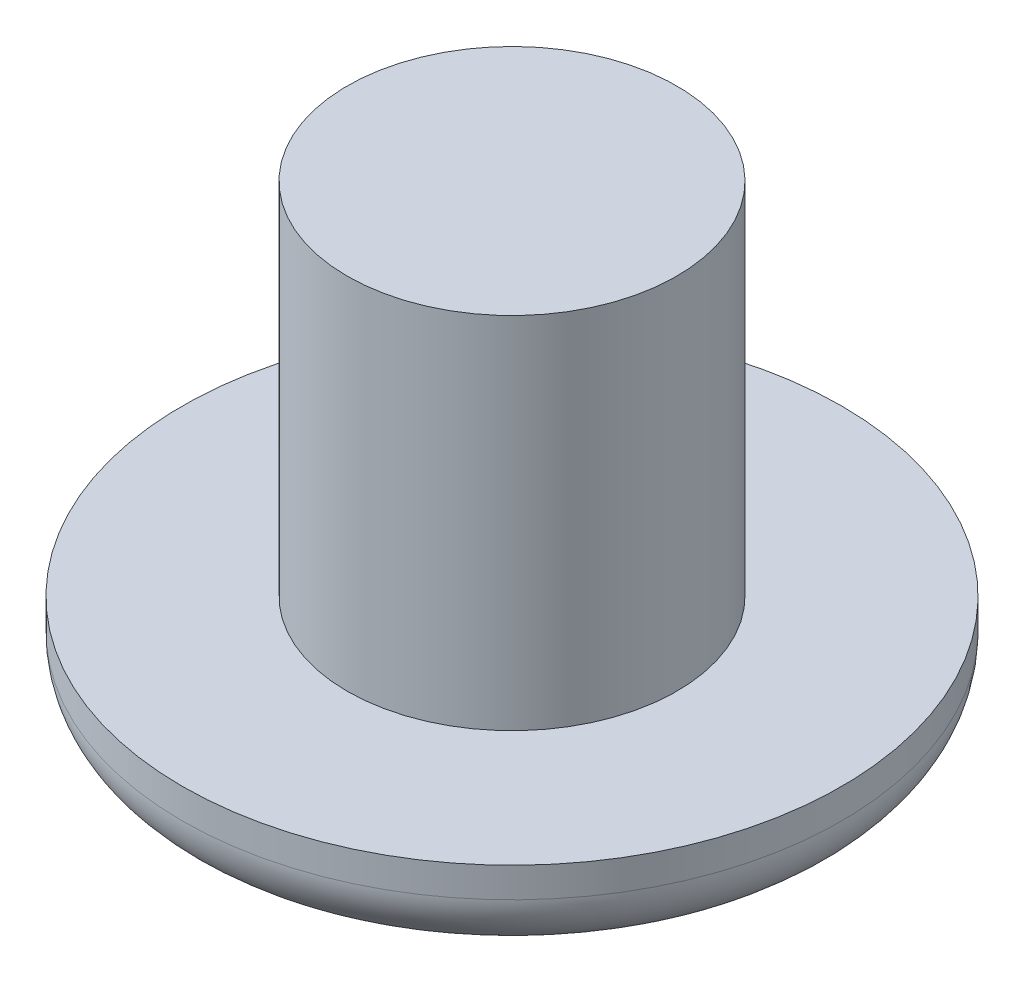
ISO-10303-21;
HEADER;
FILE_DESCRIPTION(('STEP AP214'),'2;1');
FILE_NAME('part.step','',(''),(''),'','','');
FILE_SCHEMA(('AUTOMOTIVE_DESIGN { 1 0 10303 214 1 1 1 1 }'));
ENDSEC;
DATA;
#1=APPLICATION_CONTEXT('core data for automotive mechanical design processes');
#2=APPLICATION_PROTOCOL_DEFINITION('international standard','automotive_design',2000,#1);
#3=PRODUCT_CONTEXT('',#1,'mechanical');
#4=PRODUCT('Part','Part','',(#3));
#5=PRODUCT_RELATED_PRODUCT_CATEGORY('part','',(#4));
#6=PRODUCT_DEFINITION_FORMATION('','',#4);
#7=PRODUCT_DEFINITION_CONTEXT('part definition',#1,'design');
#8=PRODUCT_DEFINITION('design','',#6,#7);
#9=PRODUCT_DEFINITION_SHAPE('','',#8);
#10=(LENGTH_UNIT() NAMED_UNIT(*) SI_UNIT(.MILLI.,.METRE.));
#11=(NAMED_UNIT(*) PLANE_ANGLE_UNIT() SI_UNIT($,.RADIAN.));
#12=(NAMED_UNIT(*) SI_UNIT($,.STERADIAN.) SOLID_ANGLE_UNIT());
#13=UNCERTAINTY_MEASURE_WITH_UNIT(LENGTH_MEASURE(1.E-05),#10,'distance_accuracy_value','');
#14=(GEOMETRIC_REPRESENTATION_CONTEXT(3) GLOBAL_UNCERTAINTY_ASSIGNED_CONTEXT((#13)) GLOBAL_UNIT_ASSIGNED_CONTEXT((#10,
#11,#12)) REPRESENTATION_CONTEXT('',''));
#15=CARTESIAN_POINT('',(0.,0.,0.));
#16=DIRECTION('',(0.,0.,1.));
#17=DIRECTION('',(1.,0.,0.));
#18=AXIS2_PLACEMENT_3D('',#15,#16,#17);
#19=CARTESIAN_POINT('',(0.,3.,0.));
#20=DIRECTION('',(0.,1.,0.));
#21=DIRECTION('',(0.,0.,1.));
#22=AXIS2_PLACEMENT_3D('',#19,#20,#21);
#23=PLANE('',#22);
#24=CARTESIAN_POINT('',(0.,3.,0.));
#25=DIRECTION('',(0.,1.,0.));
#26=DIRECTION('',(0.,0.,1.));
#27=AXIS2_PLACEMENT_3D('',#24,#25,#26);
#28=CIRCLE('',#27,11.);
#29=CARTESIAN_POINT('',(0.,3.,11.));
#30=VERTEX_POINT('',#29);
#31=EDGE_CURVE('E44',#30,#30,#28,.T.);
#32=ORIENTED_EDGE('',*,*,#31,.T.);
#33=EDGE_LOOP('',(#32));
#34=FACE_BOUND('',#33,.T.);
#35=CARTESIAN_POINT('',(0.,3.,0.));
#36=DIRECTION('',(0.,1.,0.));
#37=DIRECTION('',(0.,0.,1.));
#38=AXIS2_PLACEMENT_3D('',#35,#36,#37);
#39=CIRCLE('',#38,5.5);
#40=CARTESIAN_POINT('',(0.,3.,5.5));
#41=VERTEX_POINT('',#40);
#42=EDGE_CURVE('E48',#41,#41,#39,.T.);
#43=ORIENTED_EDGE('',*,*,#42,.F.);
#44=EDGE_LOOP('',(#43));
#45=FACE_BOUND('',#44,.T.);
#46=ADVANCED_FACE('F33',(#34,#45),#23,.T.);
#47=CARTESIAN_POINT('',(0.,0.,0.));
#48=DIRECTION('',(0.,1.,0.));
#49=DIRECTION('',(0.,0.,1.));
#50=AXIS2_PLACEMENT_3D('',#47,#48,#49);
#51=PLANE('',#50);
#52=CARTESIAN_POINT('',(0.,0.,0.));
#53=DIRECTION('',(0.,1.,0.));
#54=DIRECTION('',(0.,0.,1.));
#55=AXIS2_PLACEMENT_3D('',#52,#53,#54);
#56=CIRCLE('',#55,9.);
#57=CARTESIAN_POINT('',(0.,0.,9.));
#58=VERTEX_POINT('',#57);
#59=EDGE_CURVE('E10',#58,#58,#56,.F.);
#60=ORIENTED_EDGE('',*,*,#59,.T.);
#61=EDGE_LOOP('',(#60));
#62=FACE_BOUND('',#61,.T.);
#63=ADVANCED_FACE('F69',(#62),#51,.F.);
#64=CARTESIAN_POINT('',(0.,3.,0.));
#65=DIRECTION('',(0.,-1.,0.));
#66=DIRECTION('',(0.,0.,-1.));
#67=AXIS2_PLACEMENT_3D('',#64,#65,#66);
#68=CYLINDRICAL_SURFACE('',#67,11.);
#69=CARTESIAN_POINT('',(0.,2.,0.));
#70=DIRECTION('',(0.,1.,0.));
#71=DIRECTION('',(0.,0.,1.));
#72=AXIS2_PLACEMENT_3D('',#69,#70,#71);
#73=CIRCLE('',#72,11.);
#74=CARTESIAN_POINT('',(0.,2.,11.));
#75=VERTEX_POINT('',#74);
#76=EDGE_CURVE('E40',#75,#75,#73,.T.);
#77=ORIENTED_EDGE('',*,*,#76,.T.);
#78=EDGE_LOOP('',(#77));
#79=FACE_BOUND('',#78,.T.);
#80=ORIENTED_EDGE('',*,*,#31,.F.);
#81=EDGE_LOOP('',(#80));
#82=FACE_BOUND('',#81,.T.);
#83=ADVANCED_FACE('F61',(#79,#82),#68,.T.);
#84=CARTESIAN_POINT('',(0.,15.,0.));
#85=DIRECTION('',(0.,-1.,0.));
#86=DIRECTION('',(0.,0.,-1.));
#87=AXIS2_PLACEMENT_3D('',#84,#85,#86);
#88=CYLINDRICAL_SURFACE('',#87,5.5);
#89=ORIENTED_EDGE('',*,*,#42,.T.);
#90=EDGE_LOOP('',(#89));
#91=FACE_BOUND('',#90,.T.);
#92=CARTESIAN_POINT('',(0.,15.,0.));
#93=DIRECTION('',(0.,1.,0.));
#94=DIRECTION('',(0.,0.,1.));
#95=AXIS2_PLACEMENT_3D('',#92,#93,#94);
#96=CIRCLE('',#95,5.5);
#97=CARTESIAN_POINT('',(0.,15.,5.5));
#98=VERTEX_POINT('',#97);
#99=EDGE_CURVE('E53',#98,#98,#96,.T.);
#100=ORIENTED_EDGE('',*,*,#99,.F.);
#101=EDGE_LOOP('',(#100));
#102=FACE_BOUND('',#101,.T.);
#103=ADVANCED_FACE('F59',(#91,#102),#88,.T.);
#104=CARTESIAN_POINT('',(0.,15.,0.));
#105=DIRECTION('',(0.,1.,0.));
#106=DIRECTION('',(0.,0.,1.));
#107=AXIS2_PLACEMENT_3D('',#104,#105,#106);
#108=PLANE('',#107);
#109=ORIENTED_EDGE('',*,*,#99,.T.);
#110=EDGE_LOOP('',(#109));
#111=FACE_BOUND('',#110,.T.);
#112=ADVANCED_FACE('F57',(#111),#108,.T.);
#113=CARTESIAN_POINT('',(0.,2.,0.));
#114=DIRECTION('',(0.,1.,0.));
#115=DIRECTION('',(0.,0.,1.));
#116=AXIS2_PLACEMENT_3D('',#113,#114,#115);
#117=TOROIDAL_SURFACE('',#116,9.,2.);
#118=ORIENTED_EDGE('',*,*,#59,.F.);
#119=EDGE_LOOP('',(#118));
#120=FACE_BOUND('',#119,.T.);
#121=ORIENTED_EDGE('',*,*,#76,.F.);
#122=EDGE_LOOP('',(#121));
#123=FACE_BOUND('',#122,.T.);
#124=ADVANCED_FACE('F35',(#120,#123),#117,.T.);
#125=CLOSED_SHELL('',(#46,#63,#83,#103,#112,#124));
#126=MANIFOLD_SOLID_BREP('B2',#125);
#127=ADVANCED_BREP_SHAPE_REPRESENTATION('',(#18,#126),#14);
#128=SHAPE_DEFINITION_REPRESENTATION(#9,#127);
ENDSEC;
END-ISO-10303-21;
